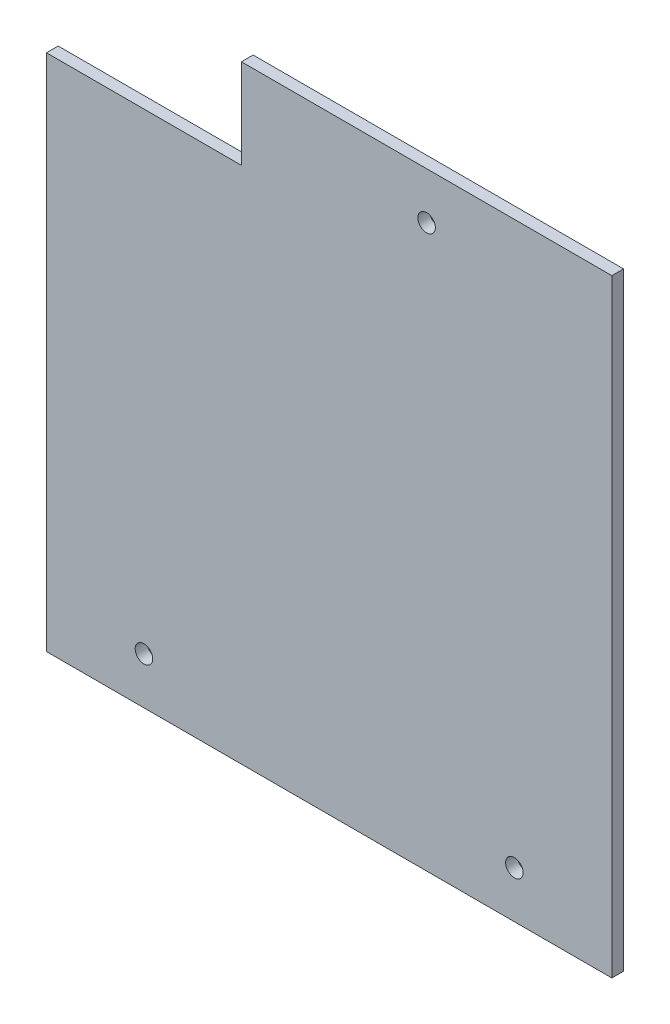
ISO-10303-21;
HEADER;
FILE_DESCRIPTION(('STEP AP214'),'2;1');
FILE_NAME('part.step','',(''),(''),'','','');
FILE_SCHEMA(('AUTOMOTIVE_DESIGN { 1 0 10303 214 1 1 1 1 }'));
ENDSEC;
DATA;
#1=APPLICATION_CONTEXT('core data for automotive mechanical design processes');
#2=APPLICATION_PROTOCOL_DEFINITION('international standard','automotive_design',2000,#1);
#3=PRODUCT_CONTEXT('',#1,'mechanical');
#4=PRODUCT('Part','Part','',(#3));
#5=PRODUCT_RELATED_PRODUCT_CATEGORY('part','',(#4));
#6=PRODUCT_DEFINITION_FORMATION('','',#4);
#7=PRODUCT_DEFINITION_CONTEXT('part definition',#1,'design');
#8=PRODUCT_DEFINITION('design','',#6,#7);
#9=PRODUCT_DEFINITION_SHAPE('','',#8);
#10=(LENGTH_UNIT() NAMED_UNIT(*) SI_UNIT(.MILLI.,.METRE.));
#11=(NAMED_UNIT(*) PLANE_ANGLE_UNIT() SI_UNIT($,.RADIAN.));
#12=(NAMED_UNIT(*) SI_UNIT($,.STERADIAN.) SOLID_ANGLE_UNIT());
#13=UNCERTAINTY_MEASURE_WITH_UNIT(LENGTH_MEASURE(1.E-05),#10,'distance_accuracy_value','');
#14=(GEOMETRIC_REPRESENTATION_CONTEXT(3) GLOBAL_UNCERTAINTY_ASSIGNED_CONTEXT((#13)) GLOBAL_UNIT_ASSIGNED_CONTEXT((#10,
#11,#12)) REPRESENTATION_CONTEXT('',''));
#15=CARTESIAN_POINT('',(0.,0.,0.));
#16=DIRECTION('',(0.,0.,1.));
#17=DIRECTION('',(1.,0.,0.));
#18=AXIS2_PLACEMENT_3D('',#15,#16,#17);
#19=CARTESIAN_POINT('',(-72.5,-78.,3.));
#20=DIRECTION('',(1.,0.,0.));
#21=DIRECTION('',(0.,0.,-1.));
#22=AXIS2_PLACEMENT_3D('',#19,#20,#21);
#23=PLANE('',#22);
#24=DIRECTION('',(0.,-1.,0.));
#25=VECTOR('',#24,1.);
#26=CARTESIAN_POINT('',(-72.5,-78.,3.));
#27=LINE('',#26,#25);
#28=CARTESIAN_POINT('',(-72.5,55.,3.));
#29=VERTEX_POINT('',#28);
#30=CARTESIAN_POINT('',(-72.5,-78.,3.));
#31=VERTEX_POINT('',#30);
#32=EDGE_CURVE('E87',#29,#31,#27,.T.);
#33=ORIENTED_EDGE('',*,*,#32,.F.);
#34=DIRECTION('',(0.,0.,-1.));
#35=VECTOR('',#34,1.);
#36=CARTESIAN_POINT('',(-72.5,55.,3.));
#37=LINE('',#36,#35);
#38=CARTESIAN_POINT('',(-72.5,55.,0.));
#39=VERTEX_POINT('',#38);
#40=EDGE_CURVE('E146',#29,#39,#37,.T.);
#41=ORIENTED_EDGE('',*,*,#40,.T.);
#42=DIRECTION('',(0.,-1.,0.));
#43=VECTOR('',#42,1.);
#44=CARTESIAN_POINT('',(-72.5,-78.,0.));
#45=LINE('',#44,#43);
#46=CARTESIAN_POINT('',(-72.5,-78.,0.));
#47=VERTEX_POINT('',#46);
#48=EDGE_CURVE('E127',#39,#47,#45,.T.);
#49=ORIENTED_EDGE('',*,*,#48,.T.);
#50=DIRECTION('',(0.,0.,-1.));
#51=VECTOR('',#50,1.);
#52=CARTESIAN_POINT('',(-72.5,-78.,3.));
#53=LINE('',#52,#51);
#54=EDGE_CURVE('E11',#31,#47,#53,.T.);
#55=ORIENTED_EDGE('',*,*,#54,.F.);
#56=EDGE_LOOP('',(#33,#41,#49,#55));
#57=FACE_BOUND('',#56,.T.);
#58=ADVANCED_FACE('F42',(#57),#23,.F.);
#59=CARTESIAN_POINT('',(72.5,-78.,3.));
#60=DIRECTION('',(0.,1.,0.));
#61=DIRECTION('',(-1.,0.,0.));
#62=AXIS2_PLACEMENT_3D('',#59,#60,#61);
#63=PLANE('',#62);
#64=DIRECTION('',(1.,0.,0.));
#65=VECTOR('',#64,1.);
#66=CARTESIAN_POINT('',(72.5,-78.,0.));
#67=LINE('',#66,#65);
#68=CARTESIAN_POINT('',(72.5,-78.,0.));
#69=VERTEX_POINT('',#68);
#70=EDGE_CURVE('E129',#47,#69,#67,.T.);
#71=ORIENTED_EDGE('',*,*,#70,.T.);
#72=DIRECTION('',(0.,0.,-1.));
#73=VECTOR('',#72,1.);
#74=CARTESIAN_POINT('',(72.5,-78.,3.));
#75=LINE('',#74,#73);
#76=CARTESIAN_POINT('',(72.5,-78.,3.));
#77=VERTEX_POINT('',#76);
#78=EDGE_CURVE('E49',#77,#69,#75,.T.);
#79=ORIENTED_EDGE('',*,*,#78,.F.);
#80=DIRECTION('',(1.,0.,0.));
#81=VECTOR('',#80,1.);
#82=CARTESIAN_POINT('',(72.5,-78.,3.));
#83=LINE('',#82,#81);
#84=EDGE_CURVE('E123',#31,#77,#83,.T.);
#85=ORIENTED_EDGE('',*,*,#84,.F.);
#86=ORIENTED_EDGE('',*,*,#54,.T.);
#87=EDGE_LOOP('',(#71,#79,#85,#86));
#88=FACE_BOUND('',#87,.T.);
#89=ADVANCED_FACE('F168',(#88),#63,.F.);
#90=CARTESIAN_POINT('',(72.5,-78.,3.));
#91=DIRECTION('',(-1.,0.,0.));
#92=DIRECTION('',(0.,0.,1.));
#93=AXIS2_PLACEMENT_3D('',#90,#91,#92);
#94=PLANE('',#93);
#95=DIRECTION('',(0.,1.,0.));
#96=VECTOR('',#95,1.);
#97=CARTESIAN_POINT('',(72.5,-78.,0.));
#98=LINE('',#97,#96);
#99=CARTESIAN_POINT('',(72.5,78.,0.));
#100=VERTEX_POINT('',#99);
#101=EDGE_CURVE('E82',#69,#100,#98,.T.);
#102=ORIENTED_EDGE('',*,*,#101,.T.);
#103=DIRECTION('',(0.,0.,-1.));
#104=VECTOR('',#103,1.);
#105=CARTESIAN_POINT('',(72.5,78.,3.));
#106=LINE('',#105,#104);
#107=CARTESIAN_POINT('',(72.5,78.,3.));
#108=VERTEX_POINT('',#107);
#109=EDGE_CURVE('E120',#108,#100,#106,.T.);
#110=ORIENTED_EDGE('',*,*,#109,.F.);
#111=DIRECTION('',(0.,1.,0.));
#112=VECTOR('',#111,1.);
#113=CARTESIAN_POINT('',(72.5,-78.,3.));
#114=LINE('',#113,#112);
#115=EDGE_CURVE('E65',#77,#108,#114,.T.);
#116=ORIENTED_EDGE('',*,*,#115,.F.);
#117=ORIENTED_EDGE('',*,*,#78,.T.);
#118=EDGE_LOOP('',(#102,#110,#116,#117));
#119=FACE_BOUND('',#118,.T.);
#120=ADVANCED_FACE('F134',(#119),#94,.F.);
#121=CARTESIAN_POINT('',(72.5,78.,3.));
#122=DIRECTION('',(0.,-1.,0.));
#123=DIRECTION('',(1.,0.,0.));
#124=AXIS2_PLACEMENT_3D('',#121,#122,#123);
#125=PLANE('',#124);
#126=DIRECTION('',(-1.,0.,0.));
#127=VECTOR('',#126,1.);
#128=CARTESIAN_POINT('',(72.5,78.,0.));
#129=LINE('',#128,#127);
#130=CARTESIAN_POINT('',(-22.5,78.,0.));
#131=VERTEX_POINT('',#130);
#132=EDGE_CURVE('E116',#100,#131,#129,.T.);
#133=ORIENTED_EDGE('',*,*,#132,.T.);
#134=DIRECTION('',(0.,0.,-1.));
#135=VECTOR('',#134,1.);
#136=CARTESIAN_POINT('',(-22.5,78.,3.));
#137=LINE('',#136,#135);
#138=CARTESIAN_POINT('',(-22.5,78.,3.));
#139=VERTEX_POINT('',#138);
#140=EDGE_CURVE('E56',#139,#131,#137,.T.);
#141=ORIENTED_EDGE('',*,*,#140,.F.);
#142=DIRECTION('',(-1.,0.,0.));
#143=VECTOR('',#142,1.);
#144=CARTESIAN_POINT('',(72.5,78.,3.));
#145=LINE('',#144,#143);
#146=EDGE_CURVE('E114',#108,#139,#145,.T.);
#147=ORIENTED_EDGE('',*,*,#146,.F.);
#148=ORIENTED_EDGE('',*,*,#109,.T.);
#149=EDGE_LOOP('',(#133,#141,#147,#148));
#150=FACE_BOUND('',#149,.T.);
#151=ADVANCED_FACE('F113',(#150),#125,.F.);
#152=CARTESIAN_POINT('',(0.,0.,3.));
#153=DIRECTION('',(0.,0.,1.));
#154=DIRECTION('',(1.,0.,0.));
#155=AXIS2_PLACEMENT_3D('',#152,#153,#154);
#156=PLANE('',#155);
#157=DIRECTION('',(-1.,0.,0.));
#158=VECTOR('',#157,1.);
#159=CARTESIAN_POINT('',(-72.5,55.,3.));
#160=LINE('',#159,#158);
#161=CARTESIAN_POINT('',(-22.5,55.,3.));
#162=VERTEX_POINT('',#161);
#163=EDGE_CURVE('E107',#162,#29,#160,.T.);
#164=ORIENTED_EDGE('',*,*,#163,.T.);
#165=ORIENTED_EDGE('',*,*,#32,.T.);
#166=ORIENTED_EDGE('',*,*,#84,.T.);
#167=ORIENTED_EDGE('',*,*,#115,.T.);
#168=ORIENTED_EDGE('',*,*,#146,.T.);
#169=DIRECTION('',(0.,-1.,0.));
#170=VECTOR('',#169,1.);
#171=CARTESIAN_POINT('',(-22.5,78.,3.));
#172=LINE('',#171,#170);
#173=EDGE_CURVE('E103',#139,#162,#172,.T.);
#174=ORIENTED_EDGE('',*,*,#173,.T.);
#175=EDGE_LOOP('',(#164,#165,#166,#167,#168,#174));
#176=FACE_BOUND('',#175,.T.);
#177=CARTESIAN_POINT('',(25.,66.,3.));
#178=DIRECTION('',(0.,0.,1.));
#179=DIRECTION('',(1.,0.,0.));
#180=AXIS2_PLACEMENT_3D('',#177,#178,#179);
#181=CIRCLE('',#180,2.25);
#182=CARTESIAN_POINT('',(27.25,66.,3.));
#183=VERTEX_POINT('',#182);
#184=EDGE_CURVE('E149',#183,#183,#181,.T.);
#185=ORIENTED_EDGE('',*,*,#184,.F.);
#186=EDGE_LOOP('',(#185));
#187=FACE_BOUND('',#186,.T.);
#188=CARTESIAN_POINT('',(-47.5,-66.,3.));
#189=DIRECTION('',(0.,0.,1.));
#190=DIRECTION('',(1.,0.,0.));
#191=AXIS2_PLACEMENT_3D('',#188,#189,#190);
#192=CIRCLE('',#191,2.25);
#193=CARTESIAN_POINT('',(-45.25,-66.,3.));
#194=VERTEX_POINT('',#193);
#195=EDGE_CURVE('E154',#194,#194,#192,.T.);
#196=ORIENTED_EDGE('',*,*,#195,.F.);
#197=EDGE_LOOP('',(#196));
#198=FACE_BOUND('',#197,.T.);
#199=CARTESIAN_POINT('',(47.5,-66.,3.));
#200=DIRECTION('',(0.,0.,1.));
#201=DIRECTION('',(1.,0.,0.));
#202=AXIS2_PLACEMENT_3D('',#199,#200,#201);
#203=CIRCLE('',#202,2.25);
#204=CARTESIAN_POINT('',(49.75,-66.,3.));
#205=VERTEX_POINT('',#204);
#206=EDGE_CURVE('E160',#205,#205,#203,.T.);
#207=ORIENTED_EDGE('',*,*,#206,.F.);
#208=EDGE_LOOP('',(#207));
#209=FACE_BOUND('',#208,.T.);
#210=ADVANCED_FACE('F118',(#176,#187,#198,#209),#156,.T.);
#211=CARTESIAN_POINT('',(0.,0.,0.));
#212=DIRECTION('',(0.,0.,1.));
#213=DIRECTION('',(1.,0.,0.));
#214=AXIS2_PLACEMENT_3D('',#211,#212,#213);
#215=PLANE('',#214);
#216=CARTESIAN_POINT('',(25.,66.,0.));
#217=DIRECTION('',(0.,0.,1.));
#218=DIRECTION('',(1.,0.,0.));
#219=AXIS2_PLACEMENT_3D('',#216,#217,#218);
#220=CIRCLE('',#219,2.25);
#221=CARTESIAN_POINT('',(27.25,66.,0.));
#222=VERTEX_POINT('',#221);
#223=EDGE_CURVE('E151',#222,#222,#220,.F.);
#224=ORIENTED_EDGE('',*,*,#223,.F.);
#225=EDGE_LOOP('',(#224));
#226=FACE_BOUND('',#225,.T.);
#227=CARTESIAN_POINT('',(-47.5,-66.,0.));
#228=DIRECTION('',(0.,0.,1.));
#229=DIRECTION('',(1.,0.,0.));
#230=AXIS2_PLACEMENT_3D('',#227,#228,#229);
#231=CIRCLE('',#230,2.25);
#232=CARTESIAN_POINT('',(-45.25,-66.,0.));
#233=VERTEX_POINT('',#232);
#234=EDGE_CURVE('E157',#233,#233,#231,.F.);
#235=ORIENTED_EDGE('',*,*,#234,.F.);
#236=EDGE_LOOP('',(#235));
#237=FACE_BOUND('',#236,.T.);
#238=CARTESIAN_POINT('',(47.5,-66.,0.));
#239=DIRECTION('',(0.,0.,1.));
#240=DIRECTION('',(1.,0.,0.));
#241=AXIS2_PLACEMENT_3D('',#238,#239,#240);
#242=CIRCLE('',#241,2.25);
#243=CARTESIAN_POINT('',(49.75,-66.,0.));
#244=VERTEX_POINT('',#243);
#245=EDGE_CURVE('E130',#244,#244,#242,.F.);
#246=ORIENTED_EDGE('',*,*,#245,.F.);
#247=EDGE_LOOP('',(#246));
#248=FACE_BOUND('',#247,.T.);
#249=ORIENTED_EDGE('',*,*,#48,.F.);
#250=DIRECTION('',(-1.,0.,0.));
#251=VECTOR('',#250,1.);
#252=CARTESIAN_POINT('',(-72.5,55.,0.));
#253=LINE('',#252,#251);
#254=CARTESIAN_POINT('',(-22.5,55.,0.));
#255=VERTEX_POINT('',#254);
#256=EDGE_CURVE('E108',#255,#39,#253,.T.);
#257=ORIENTED_EDGE('',*,*,#256,.F.);
#258=DIRECTION('',(0.,-1.,0.));
#259=VECTOR('',#258,1.);
#260=CARTESIAN_POINT('',(-22.5,78.,0.));
#261=LINE('',#260,#259);
#262=EDGE_CURVE('E141',#131,#255,#261,.T.);
#263=ORIENTED_EDGE('',*,*,#262,.F.);
#264=ORIENTED_EDGE('',*,*,#132,.F.);
#265=ORIENTED_EDGE('',*,*,#101,.F.);
#266=ORIENTED_EDGE('',*,*,#70,.F.);
#267=EDGE_LOOP('',(#249,#257,#263,#264,#265,#266));
#268=FACE_BOUND('',#267,.T.);
#269=ADVANCED_FACE('F139',(#226,#237,#248,#268),#215,.F.);
#270=CARTESIAN_POINT('',(47.5,-66.,3.));
#271=DIRECTION('',(0.,0.,1.));
#272=DIRECTION('',(1.,0.,0.));
#273=AXIS2_PLACEMENT_3D('',#270,#271,#272);
#274=CYLINDRICAL_SURFACE('',#273,2.25);
#275=ORIENTED_EDGE('',*,*,#245,.T.);
#276=EDGE_LOOP('',(#275));
#277=FACE_BOUND('',#276,.T.);
#278=ORIENTED_EDGE('',*,*,#206,.T.);
#279=EDGE_LOOP('',(#278));
#280=FACE_BOUND('',#279,.T.);
#281=ADVANCED_FACE('F196',(#277,#280),#274,.F.);
#282=CARTESIAN_POINT('',(-47.5,-66.,3.));
#283=DIRECTION('',(0.,0.,1.));
#284=DIRECTION('',(1.,0.,0.));
#285=AXIS2_PLACEMENT_3D('',#282,#283,#284);
#286=CYLINDRICAL_SURFACE('',#285,2.25);
#287=ORIENTED_EDGE('',*,*,#234,.T.);
#288=EDGE_LOOP('',(#287));
#289=FACE_BOUND('',#288,.T.);
#290=ORIENTED_EDGE('',*,*,#195,.T.);
#291=EDGE_LOOP('',(#290));
#292=FACE_BOUND('',#291,.T.);
#293=ADVANCED_FACE('F181',(#289,#292),#286,.F.);
#294=CARTESIAN_POINT('',(25.,66.,3.));
#295=DIRECTION('',(0.,0.,1.));
#296=DIRECTION('',(1.,0.,0.));
#297=AXIS2_PLACEMENT_3D('',#294,#295,#296);
#298=CYLINDRICAL_SURFACE('',#297,2.25);
#299=ORIENTED_EDGE('',*,*,#223,.T.);
#300=EDGE_LOOP('',(#299));
#301=FACE_BOUND('',#300,.T.);
#302=ORIENTED_EDGE('',*,*,#184,.T.);
#303=EDGE_LOOP('',(#302));
#304=FACE_BOUND('',#303,.T.);
#305=ADVANCED_FACE('F173',(#301,#304),#298,.F.);
#306=CARTESIAN_POINT('',(-72.5,55.,3.));
#307=DIRECTION('',(0.,-1.,0.));
#308=DIRECTION('',(1.,0.,0.));
#309=AXIS2_PLACEMENT_3D('',#306,#307,#308);
#310=PLANE('',#309);
#311=ORIENTED_EDGE('',*,*,#256,.T.);
#312=ORIENTED_EDGE('',*,*,#40,.F.);
#313=ORIENTED_EDGE('',*,*,#163,.F.);
#314=DIRECTION('',(0.,0.,-1.));
#315=VECTOR('',#314,1.);
#316=CARTESIAN_POINT('',(-22.5,55.,3.));
#317=LINE('',#316,#315);
#318=EDGE_CURVE('E105',#162,#255,#317,.T.);
#319=ORIENTED_EDGE('',*,*,#318,.T.);
#320=EDGE_LOOP('',(#311,#312,#313,#319));
#321=FACE_BOUND('',#320,.T.);
#322=ADVANCED_FACE('F171',(#321),#310,.F.);
#323=CARTESIAN_POINT('',(-22.5,78.,3.));
#324=DIRECTION('',(1.,0.,0.));
#325=DIRECTION('',(0.,0.,-1.));
#326=AXIS2_PLACEMENT_3D('',#323,#324,#325);
#327=PLANE('',#326);
#328=ORIENTED_EDGE('',*,*,#262,.T.);
#329=ORIENTED_EDGE('',*,*,#318,.F.);
#330=ORIENTED_EDGE('',*,*,#173,.F.);
#331=ORIENTED_EDGE('',*,*,#140,.T.);
#332=EDGE_LOOP('',(#328,#329,#330,#331));
#333=FACE_BOUND('',#332,.T.);
#334=ADVANCED_FACE('F104',(#333),#327,.F.);
#335=CLOSED_SHELL('',(#58,#89,#120,#151,#210,#269,#281,#293,#305,#322,#334));
#336=MANIFOLD_SOLID_BREP('B2',#335);
#337=ADVANCED_BREP_SHAPE_REPRESENTATION('',(#18,#336),#14);
#338=SHAPE_DEFINITION_REPRESENTATION(#9,#337);
ENDSEC;
END-ISO-10303-21;
